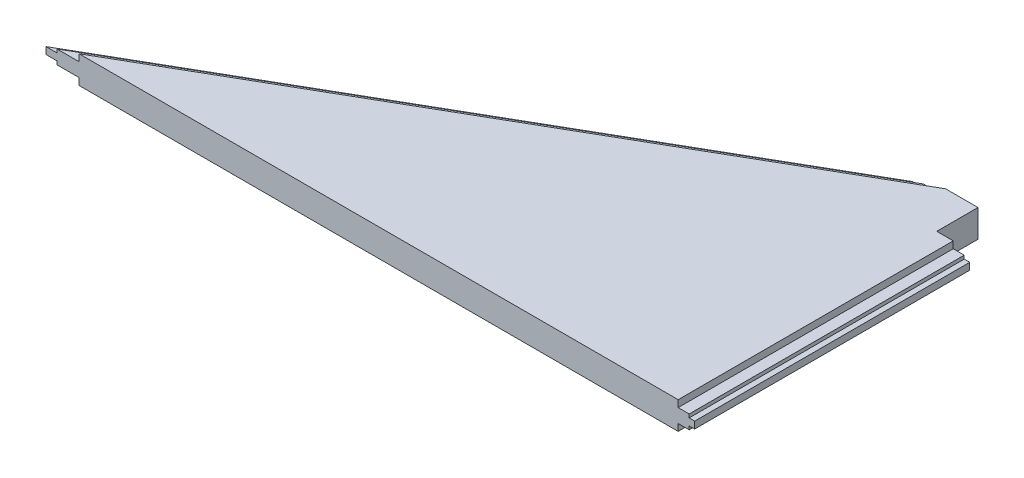
ISO-10303-21;
HEADER;
FILE_DESCRIPTION(('STEP AP214'),'2;1');
FILE_NAME('part.step','',(''),(''),'','','');
FILE_SCHEMA(('AUTOMOTIVE_DESIGN { 1 0 10303 214 1 1 1 1 }'));
ENDSEC;
DATA;
#1=APPLICATION_CONTEXT('core data for automotive mechanical design processes');
#2=APPLICATION_PROTOCOL_DEFINITION('international standard','automotive_design',2000,#1);
#3=PRODUCT_CONTEXT('',#1,'mechanical');
#4=PRODUCT('Part','Part','',(#3));
#5=PRODUCT_RELATED_PRODUCT_CATEGORY('part','',(#4));
#6=PRODUCT_DEFINITION_FORMATION('','',#4);
#7=PRODUCT_DEFINITION_CONTEXT('part definition',#1,'design');
#8=PRODUCT_DEFINITION('design','',#6,#7);
#9=PRODUCT_DEFINITION_SHAPE('','',#8);
#10=(LENGTH_UNIT() NAMED_UNIT(*) SI_UNIT(.MILLI.,.METRE.));
#11=(NAMED_UNIT(*) PLANE_ANGLE_UNIT() SI_UNIT($,.RADIAN.));
#12=(NAMED_UNIT(*) SI_UNIT($,.STERADIAN.) SOLID_ANGLE_UNIT());
#13=UNCERTAINTY_MEASURE_WITH_UNIT(LENGTH_MEASURE(1.E-05),#10,'distance_accuracy_value','');
#14=(GEOMETRIC_REPRESENTATION_CONTEXT(3) GLOBAL_UNCERTAINTY_ASSIGNED_CONTEXT((#13)) GLOBAL_UNIT_ASSIGNED_CONTEXT((#10,
#11,#12)) REPRESENTATION_CONTEXT('',''));
#15=CARTESIAN_POINT('',(0.,0.,0.));
#16=DIRECTION('',(0.,0.,1.));
#17=DIRECTION('',(1.,0.,0.));
#18=AXIS2_PLACEMENT_3D('',#15,#16,#17);
#19=CARTESIAN_POINT('',(0.,-6.35,-146.05));
#20=DIRECTION('',(0.,0.,-1.));
#21=DIRECTION('',(-1.,0.,0.));
#22=AXIS2_PLACEMENT_3D('',#19,#20,#21);
#23=PLANE('',#22);
#24=DIRECTION('',(0.,1.,0.));
#25=VECTOR('',#24,1.);
#26=CARTESIAN_POINT('',(-50.8,-15.24,-146.05));
#27=LINE('',#26,#25);
#28=CARTESIAN_POINT('',(-50.8,-6.35,-146.05));
#29=VERTEX_POINT('',#28);
#30=CARTESIAN_POINT('',(-50.8,6.35,-146.05));
#31=VERTEX_POINT('',#30);
#32=EDGE_CURVE('E197',#29,#31,#27,.T.);
#33=ORIENTED_EDGE('',*,*,#32,.F.);
#34=DIRECTION('',(-1.,0.,0.));
#35=VECTOR('',#34,1.);
#36=CARTESIAN_POINT('',(0.,-6.35,-146.05));
#37=LINE('',#36,#35);
#38=CARTESIAN_POINT('',(-65.7751226527547,-6.35,-146.05));
#39=VERTEX_POINT('',#38);
#40=EDGE_CURVE('E226',#29,#39,#37,.T.);
#41=ORIENTED_EDGE('',*,*,#40,.T.);
#42=DIRECTION('',(0.,-1.,0.));
#43=VECTOR('',#42,1.);
#44=CARTESIAN_POINT('',(-65.7751226527547,-6.35,-146.05));
#45=LINE('',#44,#43);
#46=CARTESIAN_POINT('',(-65.7751226527545,-3.175,-146.05));
#47=VERTEX_POINT('',#46);
#48=EDGE_CURVE('E342',#47,#39,#45,.T.);
#49=ORIENTED_EDGE('',*,*,#48,.F.);
#50=DIRECTION('',(1.,0.,0.));
#51=VECTOR('',#50,1.);
#52=CARTESIAN_POINT('',(0.,-3.175,-146.05));
#53=LINE('',#52,#51);
#54=CARTESIAN_POINT('',(-75.9662846936072,-3.175,-146.05));
#55=VERTEX_POINT('',#54);
#56=EDGE_CURVE('E376',#55,#47,#53,.T.);
#57=ORIENTED_EDGE('',*,*,#56,.F.);
#58=DIRECTION('',(0.,1.,0.));
#59=VECTOR('',#58,1.);
#60=CARTESIAN_POINT('',(-75.9662846936071,-6.35,-146.05));
#61=LINE('',#60,#59);
#62=CARTESIAN_POINT('',(-75.9662846936073,-1.5875,-146.05));
#63=VERTEX_POINT('',#62);
#64=EDGE_CURVE('E368',#55,#63,#61,.T.);
#65=ORIENTED_EDGE('',*,*,#64,.T.);
#66=DIRECTION('',(-1.,0.,0.));
#67=VECTOR('',#66,1.);
#68=CARTESIAN_POINT('',(0.,-1.58749999999999,-146.05));
#69=LINE('',#68,#67);
#70=CARTESIAN_POINT('',(-81.0618657140334,-1.5875,-146.05));
#71=VERTEX_POINT('',#70);
#72=EDGE_CURVE('E334',#63,#71,#69,.T.);
#73=ORIENTED_EDGE('',*,*,#72,.T.);
#74=DIRECTION('',(0.,1.,0.));
#75=VECTOR('',#74,1.);
#76=CARTESIAN_POINT('',(-81.0618657140334,-6.35,-146.05));
#77=LINE('',#76,#75);
#78=CARTESIAN_POINT('',(-81.0618657140334,1.5875,-146.05));
#79=VERTEX_POINT('',#78);
#80=EDGE_CURVE('E338',#71,#79,#77,.T.);
#81=ORIENTED_EDGE('',*,*,#80,.T.);
#82=DIRECTION('',(1.,0.,0.));
#83=VECTOR('',#82,1.);
#84=CARTESIAN_POINT('',(0.,1.58750000000001,-146.05));
#85=LINE('',#84,#83);
#86=CARTESIAN_POINT('',(-75.9662846936072,1.5875,-146.05));
#87=VERTEX_POINT('',#86);
#88=EDGE_CURVE('E320',#79,#87,#85,.T.);
#89=ORIENTED_EDGE('',*,*,#88,.T.);
#90=DIRECTION('',(0.,1.,0.));
#91=VECTOR('',#90,1.);
#92=CARTESIAN_POINT('',(-75.9662846936071,-6.35,-146.05));
#93=LINE('',#92,#91);
#94=CARTESIAN_POINT('',(-75.9662846936071,3.175,-146.05));
#95=VERTEX_POINT('',#94);
#96=EDGE_CURVE('E353',#87,#95,#93,.T.);
#97=ORIENTED_EDGE('',*,*,#96,.T.);
#98=DIRECTION('',(1.,0.,0.));
#99=VECTOR('',#98,1.);
#100=CARTESIAN_POINT('',(0.,3.175,-146.05));
#101=LINE('',#100,#99);
#102=CARTESIAN_POINT('',(-65.7751226527548,3.175,-146.05));
#103=VERTEX_POINT('',#102);
#104=EDGE_CURVE('E361',#95,#103,#101,.T.);
#105=ORIENTED_EDGE('',*,*,#104,.T.);
#106=DIRECTION('',(0.,1.,0.));
#107=VECTOR('',#106,1.);
#108=CARTESIAN_POINT('',(-65.7751226527547,-6.35,-146.05));
#109=LINE('',#108,#107);
#110=CARTESIAN_POINT('',(-65.7751226527547,6.35,-146.05));
#111=VERTEX_POINT('',#110);
#112=EDGE_CURVE('E219',#103,#111,#109,.T.);
#113=ORIENTED_EDGE('',*,*,#112,.T.);
#114=DIRECTION('',(-1.,0.,0.));
#115=VECTOR('',#114,1.);
#116=CARTESIAN_POINT('',(0.,6.35,-146.05));
#117=LINE('',#116,#115);
#118=EDGE_CURVE('E214',#31,#111,#117,.T.);
#119=ORIENTED_EDGE('',*,*,#118,.F.);
#120=EDGE_LOOP('',(#33,#41,#49,#57,#65,#73,#81,#89,#97,#105,#113,#119));
#121=FACE_BOUND('',#120,.T.);
#122=ADVANCED_FACE('F47',(#121),#23,.T.);
#123=CARTESIAN_POINT('',(-406.4,-6.35,0.));
#124=DIRECTION('',(0.,0.,1.));
#125=DIRECTION('',(1.,0.,0.));
#126=AXIS2_PLACEMENT_3D('',#123,#124,#125);
#127=PLANE('',#126);
#128=DIRECTION('',(1.,0.,0.));
#129=VECTOR('',#128,1.);
#130=CARTESIAN_POINT('',(-406.4,6.35,0.));
#131=LINE('',#130,#129);
#132=CARTESIAN_POINT('',(-319.775122652755,6.35,0.));
#133=VERTEX_POINT('',#132);
#134=CARTESIAN_POINT('',(-43.18,6.35,0.));
#135=VERTEX_POINT('',#134);
#136=EDGE_CURVE('E221',#133,#135,#131,.T.);
#137=ORIENTED_EDGE('',*,*,#136,.F.);
#138=DIRECTION('',(0.,-1.,0.));
#139=VECTOR('',#138,1.);
#140=CARTESIAN_POINT('',(-319.775122652755,-6.35,0.));
#141=LINE('',#140,#139);
#142=CARTESIAN_POINT('',(-319.775122652755,3.175,0.));
#143=VERTEX_POINT('',#142);
#144=EDGE_CURVE('E70',#133,#143,#141,.T.);
#145=ORIENTED_EDGE('',*,*,#144,.T.);
#146=DIRECTION('',(-1.,0.,0.));
#147=VECTOR('',#146,1.);
#148=CARTESIAN_POINT('',(-406.4,3.175,0.));
#149=LINE('',#148,#147);
#150=CARTESIAN_POINT('',(-329.966284693607,3.175,0.));
#151=VERTEX_POINT('',#150);
#152=EDGE_CURVE('E364',#143,#151,#149,.T.);
#153=ORIENTED_EDGE('',*,*,#152,.T.);
#154=DIRECTION('',(0.,-1.,0.));
#155=VECTOR('',#154,1.);
#156=CARTESIAN_POINT('',(-329.966284693607,-6.35,0.));
#157=LINE('',#156,#155);
#158=CARTESIAN_POINT('',(-329.966284693607,1.5875,0.));
#159=VERTEX_POINT('',#158);
#160=EDGE_CURVE('E357',#151,#159,#157,.T.);
#161=ORIENTED_EDGE('',*,*,#160,.T.);
#162=DIRECTION('',(-1.,0.,0.));
#163=VECTOR('',#162,1.);
#164=CARTESIAN_POINT('',(-406.4,1.58749999999999,0.));
#165=LINE('',#164,#163);
#166=CARTESIAN_POINT('',(-335.061865714034,1.5875,0.));
#167=VERTEX_POINT('',#166);
#168=EDGE_CURVE('E262',#159,#167,#165,.T.);
#169=ORIENTED_EDGE('',*,*,#168,.T.);
#170=DIRECTION('',(0.,-1.,0.));
#171=VECTOR('',#170,1.);
#172=CARTESIAN_POINT('',(-335.061865714034,-6.35,0.));
#173=LINE('',#172,#171);
#174=CARTESIAN_POINT('',(-335.061865714034,-1.5875,0.));
#175=VERTEX_POINT('',#174);
#176=EDGE_CURVE('E254',#167,#175,#173,.T.);
#177=ORIENTED_EDGE('',*,*,#176,.T.);
#178=DIRECTION('',(1.,0.,0.));
#179=VECTOR('',#178,1.);
#180=CARTESIAN_POINT('',(-406.4,-1.58750000000001,0.));
#181=LINE('',#180,#179);
#182=CARTESIAN_POINT('',(-329.966284693607,-1.5875,0.));
#183=VERTEX_POINT('',#182);
#184=EDGE_CURVE('E258',#175,#183,#181,.T.);
#185=ORIENTED_EDGE('',*,*,#184,.T.);
#186=DIRECTION('',(0.,-1.,0.));
#187=VECTOR('',#186,1.);
#188=CARTESIAN_POINT('',(-329.966284693607,-6.35,0.));
#189=LINE('',#188,#187);
#190=CARTESIAN_POINT('',(-329.966284693607,-3.175,0.));
#191=VERTEX_POINT('',#190);
#192=EDGE_CURVE('E372',#183,#191,#189,.T.);
#193=ORIENTED_EDGE('',*,*,#192,.T.);
#194=DIRECTION('',(-1.,0.,0.));
#195=VECTOR('',#194,1.);
#196=CARTESIAN_POINT('',(-406.4,-3.175,0.));
#197=LINE('',#196,#195);
#198=CARTESIAN_POINT('',(-319.775122652755,-3.175,0.));
#199=VERTEX_POINT('',#198);
#200=EDGE_CURVE('E379',#199,#191,#197,.T.);
#201=ORIENTED_EDGE('',*,*,#200,.F.);
#202=DIRECTION('',(0.,1.,0.));
#203=VECTOR('',#202,1.);
#204=CARTESIAN_POINT('',(-319.775122652755,-6.35,0.));
#205=LINE('',#204,#203);
#206=CARTESIAN_POINT('',(-319.775122652755,-6.35,0.));
#207=VERTEX_POINT('',#206);
#208=EDGE_CURVE('E346',#207,#199,#205,.T.);
#209=ORIENTED_EDGE('',*,*,#208,.F.);
#210=DIRECTION('',(1.,0.,0.));
#211=VECTOR('',#210,1.);
#212=CARTESIAN_POINT('',(-406.4,-6.35,0.));
#213=LINE('',#212,#211);
#214=CARTESIAN_POINT('',(-43.18,-6.35,0.));
#215=VERTEX_POINT('',#214);
#216=EDGE_CURVE('E235',#207,#215,#213,.T.);
#217=ORIENTED_EDGE('',*,*,#216,.T.);
#218=DIRECTION('',(0.,1.,0.));
#219=VECTOR('',#218,1.);
#220=CARTESIAN_POINT('',(-43.1799999999999,-6.35,0.));
#221=LINE('',#220,#219);
#222=CARTESIAN_POINT('',(-43.18,-3.175,0.));
#223=VERTEX_POINT('',#222);
#224=EDGE_CURVE('E292',#215,#223,#221,.T.);
#225=ORIENTED_EDGE('',*,*,#224,.T.);
#226=DIRECTION('',(1.,0.,0.));
#227=VECTOR('',#226,1.);
#228=CARTESIAN_POINT('',(-38.1,-3.175,0.));
#229=LINE('',#228,#227);
#230=CARTESIAN_POINT('',(-38.1,-3.175,0.));
#231=VERTEX_POINT('',#230);
#232=EDGE_CURVE('E229',#223,#231,#229,.T.);
#233=ORIENTED_EDGE('',*,*,#232,.T.);
#234=DIRECTION('',(0.,-1.,0.));
#235=VECTOR('',#234,1.);
#236=CARTESIAN_POINT('',(-38.1,-6.35000000000322,0.));
#237=LINE('',#236,#235);
#238=CARTESIAN_POINT('',(-38.0999999999999,-1.5875,0.));
#239=VERTEX_POINT('',#238);
#240=EDGE_CURVE('E312',#239,#231,#237,.T.);
#241=ORIENTED_EDGE('',*,*,#240,.F.);
#242=DIRECTION('',(-1.,0.,0.));
#243=VECTOR('',#242,1.);
#244=CARTESIAN_POINT('',(-406.4,-1.58749999999997,0.));
#245=LINE('',#244,#243);
#246=CARTESIAN_POINT('',(-35.5599999999999,-1.5875,0.));
#247=VERTEX_POINT('',#246);
#248=EDGE_CURVE('E251',#247,#239,#245,.T.);
#249=ORIENTED_EDGE('',*,*,#248,.F.);
#250=DIRECTION('',(0.,-1.,0.));
#251=VECTOR('',#250,1.);
#252=CARTESIAN_POINT('',(-35.5599999999999,-6.35,0.));
#253=LINE('',#252,#251);
#254=CARTESIAN_POINT('',(-35.5599999999999,1.5875,0.));
#255=VERTEX_POINT('',#254);
#256=EDGE_CURVE('E248',#255,#247,#253,.T.);
#257=ORIENTED_EDGE('',*,*,#256,.F.);
#258=DIRECTION('',(1.,0.,0.));
#259=VECTOR('',#258,1.);
#260=CARTESIAN_POINT('',(-406.4,1.5875,0.));
#261=LINE('',#260,#259);
#262=CARTESIAN_POINT('',(-38.0999999999999,1.5875,0.));
#263=VERTEX_POINT('',#262);
#264=EDGE_CURVE('E245',#263,#255,#261,.T.);
#265=ORIENTED_EDGE('',*,*,#264,.F.);
#266=DIRECTION('',(0.,-1.,0.));
#267=VECTOR('',#266,1.);
#268=CARTESIAN_POINT('',(-38.0999999999999,-6.34999999999678,0.));
#269=LINE('',#268,#267);
#270=CARTESIAN_POINT('',(-38.1,3.175,0.));
#271=VERTEX_POINT('',#270);
#272=EDGE_CURVE('E285',#271,#263,#269,.T.);
#273=ORIENTED_EDGE('',*,*,#272,.F.);
#274=DIRECTION('',(1.,0.,0.));
#275=VECTOR('',#274,1.);
#276=CARTESIAN_POINT('',(-38.1,3.175,0.));
#277=LINE('',#276,#275);
#278=CARTESIAN_POINT('',(-43.18,3.175,0.));
#279=VERTEX_POINT('',#278);
#280=EDGE_CURVE('E222',#279,#271,#277,.T.);
#281=ORIENTED_EDGE('',*,*,#280,.F.);
#282=DIRECTION('',(0.,-1.,0.));
#283=VECTOR('',#282,1.);
#284=CARTESIAN_POINT('',(-43.1799999999999,-6.35,0.));
#285=LINE('',#284,#283);
#286=EDGE_CURVE('E283',#135,#279,#285,.T.);
#287=ORIENTED_EDGE('',*,*,#286,.F.);
#288=EDGE_LOOP('',(#137,#145,#153,#161,#169,#177,#185,#193,#201,#209,#217,#225,#233,#241,#249,
#257,#265,#273,#281,#287));
#289=FACE_BOUND('',#288,.T.);
#290=ADVANCED_FACE('F282',(#289),#127,.T.);
#291=CARTESIAN_POINT('',(0.,6.35,0.));
#292=DIRECTION('',(0.,-1.,0.));
#293=DIRECTION('',(0.,0.,-1.));
#294=AXIS2_PLACEMENT_3D('',#291,#292,#293);
#295=PLANE('',#294);
#296=DIRECTION('',(0.,0.,-1.));
#297=VECTOR('',#296,1.);
#298=CARTESIAN_POINT('',(-43.1799999999999,6.35,11.0490000000001));
#299=LINE('',#298,#297);
#300=CARTESIAN_POINT('',(-43.18,6.35,-127.));
#301=VERTEX_POINT('',#300);
#302=EDGE_CURVE('E290',#135,#301,#299,.T.);
#303=ORIENTED_EDGE('',*,*,#302,.T.);
#304=DIRECTION('',(1.,0.,0.));
#305=VECTOR('',#304,1.);
#306=CARTESIAN_POINT('',(-50.8,6.35,-127.));
#307=LINE('',#306,#305);
#308=CARTESIAN_POINT('',(-50.8,6.35,-127.));
#309=VERTEX_POINT('',#308);
#310=EDGE_CURVE('E209',#309,#301,#307,.T.);
#311=ORIENTED_EDGE('',*,*,#310,.F.);
#312=DIRECTION('',(0.,0.,1.));
#313=VECTOR('',#312,1.);
#314=CARTESIAN_POINT('',(-50.8,6.35,-146.05));
#315=LINE('',#314,#313);
#316=EDGE_CURVE('E201',#31,#309,#315,.T.);
#317=ORIENTED_EDGE('',*,*,#316,.F.);
#318=ORIENTED_EDGE('',*,*,#118,.T.);
#319=DIRECTION('',(0.866906303057535,0.,-0.498471124258082));
#320=VECTOR('',#319,1.);
#321=CARTESIAN_POINT('',(-424.945372258804,6.35,60.4728935234783));
#322=LINE('',#321,#320);
#323=EDGE_CURVE('E394',#133,#111,#322,.T.);
#324=ORIENTED_EDGE('',*,*,#323,.F.);
#325=ORIENTED_EDGE('',*,*,#136,.T.);
#326=EDGE_LOOP('',(#303,#311,#317,#318,#324,#325));
#327=FACE_BOUND('',#326,.T.);
#328=ADVANCED_FACE('F213',(#327),#295,.F.);
#329=CARTESIAN_POINT('',(0.,-6.35,0.));
#330=DIRECTION('',(0.,-1.,0.));
#331=DIRECTION('',(0.,0.,-1.));
#332=AXIS2_PLACEMENT_3D('',#329,#330,#331);
#333=PLANE('',#332);
#334=DIRECTION('',(-1.,0.,0.));
#335=VECTOR('',#334,1.);
#336=CARTESIAN_POINT('',(0.,-6.35,-127.));
#337=LINE('',#336,#335);
#338=CARTESIAN_POINT('',(-43.18,-6.35,-127.));
#339=VERTEX_POINT('',#338);
#340=CARTESIAN_POINT('',(-50.8,-6.35,-127.));
#341=VERTEX_POINT('',#340);
#342=EDGE_CURVE('E421',#339,#341,#337,.T.);
#343=ORIENTED_EDGE('',*,*,#342,.F.);
#344=DIRECTION('',(0.,0.,-1.));
#345=VECTOR('',#344,1.);
#346=CARTESIAN_POINT('',(-43.1799999999999,-6.35,11.0490000000001));
#347=LINE('',#346,#345);
#348=EDGE_CURVE('E304',#215,#339,#347,.T.);
#349=ORIENTED_EDGE('',*,*,#348,.F.);
#350=ORIENTED_EDGE('',*,*,#216,.F.);
#351=DIRECTION('',(0.866906303057535,0.,-0.498471124258082));
#352=VECTOR('',#351,1.);
#353=CARTESIAN_POINT('',(-424.945372258804,-6.35,60.4728935234783));
#354=LINE('',#353,#352);
#355=EDGE_CURVE('E397',#207,#39,#354,.T.);
#356=ORIENTED_EDGE('',*,*,#355,.T.);
#357=ORIENTED_EDGE('',*,*,#40,.F.);
#358=DIRECTION('',(0.,0.,-1.));
#359=VECTOR('',#358,1.);
#360=CARTESIAN_POINT('',(-50.8,-6.35,0.));
#361=LINE('',#360,#359);
#362=EDGE_CURVE('E11',#341,#29,#361,.T.);
#363=ORIENTED_EDGE('',*,*,#362,.F.);
#364=EDGE_LOOP('',(#343,#349,#350,#356,#357,#363));
#365=FACE_BOUND('',#364,.T.);
#366=ADVANCED_FACE('F480',(#365),#333,.T.);
#367=CARTESIAN_POINT('',(-38.1,3.175,0.));
#368=DIRECTION('',(0.,-1.,0.));
#369=DIRECTION('',(0.,0.,-1.));
#370=AXIS2_PLACEMENT_3D('',#367,#368,#369);
#371=PLANE('',#370);
#372=DIRECTION('',(0.,0.,-1.));
#373=VECTOR('',#372,1.);
#374=CARTESIAN_POINT('',(-38.1,3.175,0.));
#375=LINE('',#374,#373);
#376=CARTESIAN_POINT('',(-38.1,3.175,-127.));
#377=VERTEX_POINT('',#376);
#378=EDGE_CURVE('E241',#271,#377,#375,.T.);
#379=ORIENTED_EDGE('',*,*,#378,.T.);
#380=DIRECTION('',(-1.,0.,0.));
#381=VECTOR('',#380,1.);
#382=CARTESIAN_POINT('',(-38.1,3.175,-127.));
#383=LINE('',#382,#381);
#384=CARTESIAN_POINT('',(-43.18,3.175,-127.));
#385=VERTEX_POINT('',#384);
#386=EDGE_CURVE('E62',#377,#385,#383,.T.);
#387=ORIENTED_EDGE('',*,*,#386,.T.);
#388=DIRECTION('',(0.,0.,-1.));
#389=VECTOR('',#388,1.);
#390=CARTESIAN_POINT('',(-43.1799999999999,3.175,11.0490000000001));
#391=LINE('',#390,#389);
#392=EDGE_CURVE('E277',#279,#385,#391,.T.);
#393=ORIENTED_EDGE('',*,*,#392,.F.);
#394=ORIENTED_EDGE('',*,*,#280,.T.);
#395=EDGE_LOOP('',(#379,#387,#393,#394));
#396=FACE_BOUND('',#395,.T.);
#397=ADVANCED_FACE('F274',(#396),#371,.F.);
#398=CARTESIAN_POINT('',(-38.1,-3.175,0.));
#399=DIRECTION('',(0.,1.,0.));
#400=DIRECTION('',(0.,0.,1.));
#401=AXIS2_PLACEMENT_3D('',#398,#399,#400);
#402=PLANE('',#401);
#403=DIRECTION('',(0.,0.,-1.));
#404=VECTOR('',#403,1.);
#405=CARTESIAN_POINT('',(-43.1799999999999,-3.175,11.0490000000001));
#406=LINE('',#405,#404);
#407=CARTESIAN_POINT('',(-43.18,-3.175,-127.));
#408=VERTEX_POINT('',#407);
#409=EDGE_CURVE('E300',#223,#408,#406,.T.);
#410=ORIENTED_EDGE('',*,*,#409,.T.);
#411=DIRECTION('',(1.,0.,0.));
#412=VECTOR('',#411,1.);
#413=CARTESIAN_POINT('',(-38.1,-3.175,-127.));
#414=LINE('',#413,#412);
#415=CARTESIAN_POINT('',(-38.1,-3.175,-127.));
#416=VERTEX_POINT('',#415);
#417=EDGE_CURVE('E427',#408,#416,#414,.T.);
#418=ORIENTED_EDGE('',*,*,#417,.T.);
#419=DIRECTION('',(0.,0.,1.));
#420=VECTOR('',#419,1.);
#421=CARTESIAN_POINT('',(-38.1,-3.175,0.));
#422=LINE('',#421,#420);
#423=EDGE_CURVE('E238',#416,#231,#422,.T.);
#424=ORIENTED_EDGE('',*,*,#423,.T.);
#425=ORIENTED_EDGE('',*,*,#232,.F.);
#426=EDGE_LOOP('',(#410,#418,#424,#425));
#427=FACE_BOUND('',#426,.T.);
#428=ADVANCED_FACE('F486',(#427),#402,.F.);
#429=CARTESIAN_POINT('',(-43.1799999999999,0.,11.0490000000001));
#430=DIRECTION('',(1.,0.,0.));
#431=DIRECTION('',(0.,0.,-1.));
#432=AXIS2_PLACEMENT_3D('',#429,#430,#431);
#433=PLANE('',#432);
#434=DIRECTION('',(0.,-1.,0.));
#435=VECTOR('',#434,1.);
#436=CARTESIAN_POINT('',(-43.18,0.,-127.));
#437=LINE('',#436,#435);
#438=EDGE_CURVE('E424',#408,#339,#437,.T.);
#439=ORIENTED_EDGE('',*,*,#438,.F.);
#440=ORIENTED_EDGE('',*,*,#409,.F.);
#441=ORIENTED_EDGE('',*,*,#224,.F.);
#442=ORIENTED_EDGE('',*,*,#348,.T.);
#443=EDGE_LOOP('',(#439,#440,#441,#442));
#444=FACE_BOUND('',#443,.T.);
#445=ADVANCED_FACE('F489',(#444),#433,.T.);
#446=CARTESIAN_POINT('',(-43.1799999999999,0.,11.0490000000001));
#447=DIRECTION('',(-1.,0.,0.));
#448=DIRECTION('',(0.,0.,1.));
#449=AXIS2_PLACEMENT_3D('',#446,#447,#448);
#450=PLANE('',#449);
#451=ORIENTED_EDGE('',*,*,#392,.T.);
#452=DIRECTION('',(0.,1.,0.));
#453=VECTOR('',#452,1.);
#454=CARTESIAN_POINT('',(-43.18,0.,-127.));
#455=LINE('',#454,#453);
#456=EDGE_CURVE('E439',#385,#301,#455,.T.);
#457=ORIENTED_EDGE('',*,*,#456,.T.);
#458=ORIENTED_EDGE('',*,*,#302,.F.);
#459=ORIENTED_EDGE('',*,*,#286,.T.);
#460=EDGE_LOOP('',(#451,#457,#458,#459));
#461=FACE_BOUND('',#460,.T.);
#462=ADVANCED_FACE('F288',(#461),#450,.F.);
#463=CARTESIAN_POINT('',(0.,1.5875,11.0490000000001));
#464=DIRECTION('',(0.,-1.,0.));
#465=DIRECTION('',(0.,0.,-1.));
#466=AXIS2_PLACEMENT_3D('',#463,#464,#465);
#467=PLANE('',#466);
#468=DIRECTION('',(0.,0.,-1.));
#469=VECTOR('',#468,1.);
#470=CARTESIAN_POINT('',(-35.5599999999999,1.5875,11.0490000000001));
#471=LINE('',#470,#469);
#472=CARTESIAN_POINT('',(-35.5599999999999,1.5875,-127.));
#473=VERTEX_POINT('',#472);
#474=EDGE_CURVE('E316',#255,#473,#471,.T.);
#475=ORIENTED_EDGE('',*,*,#474,.T.);
#476=DIRECTION('',(-1.,0.,0.));
#477=VECTOR('',#476,1.);
#478=CARTESIAN_POINT('',(0.,1.5875,-127.));
#479=LINE('',#478,#477);
#480=CARTESIAN_POINT('',(-38.1,1.5875,-127.));
#481=VERTEX_POINT('',#480);
#482=EDGE_CURVE('E448',#473,#481,#479,.T.);
#483=ORIENTED_EDGE('',*,*,#482,.T.);
#484=DIRECTION('',(0.,0.,-1.));
#485=VECTOR('',#484,1.);
#486=CARTESIAN_POINT('',(-38.0999999999999,1.5875,11.0490000000001));
#487=LINE('',#486,#485);
#488=EDGE_CURVE('E271',#263,#481,#487,.T.);
#489=ORIENTED_EDGE('',*,*,#488,.F.);
#490=ORIENTED_EDGE('',*,*,#264,.T.);
#491=EDGE_LOOP('',(#475,#483,#489,#490));
#492=FACE_BOUND('',#491,.T.);
#493=ADVANCED_FACE('F498',(#492),#467,.F.);
#494=CARTESIAN_POINT('',(-35.5599999999999,0.,11.0490000000001));
#495=DIRECTION('',(-1.,0.,0.));
#496=DIRECTION('',(0.,0.,1.));
#497=AXIS2_PLACEMENT_3D('',#494,#495,#496);
#498=PLANE('',#497);
#499=DIRECTION('',(0.,0.,-1.));
#500=VECTOR('',#499,1.);
#501=CARTESIAN_POINT('',(-35.5599999999999,-1.5875,11.0490000000001));
#502=LINE('',#501,#500);
#503=CARTESIAN_POINT('',(-35.56,-1.5875,-127.));
#504=VERTEX_POINT('',#503);
#505=EDGE_CURVE('E324',#247,#504,#502,.T.);
#506=ORIENTED_EDGE('',*,*,#505,.T.);
#507=DIRECTION('',(0.,1.,0.));
#508=VECTOR('',#507,1.);
#509=CARTESIAN_POINT('',(-35.56,0.,-127.));
#510=LINE('',#509,#508);
#511=EDGE_CURVE('E442',#504,#473,#510,.T.);
#512=ORIENTED_EDGE('',*,*,#511,.T.);
#513=ORIENTED_EDGE('',*,*,#474,.F.);
#514=ORIENTED_EDGE('',*,*,#256,.T.);
#515=EDGE_LOOP('',(#506,#512,#513,#514));
#516=FACE_BOUND('',#515,.T.);
#517=ADVANCED_FACE('F501',(#516),#498,.F.);
#518=CARTESIAN_POINT('',(0.,-1.5875,11.0490000000001));
#519=DIRECTION('',(0.,1.,0.));
#520=DIRECTION('',(-1.,0.,0.));
#521=AXIS2_PLACEMENT_3D('',#518,#519,#520);
#522=PLANE('',#521);
#523=DIRECTION('',(0.,0.,-1.));
#524=VECTOR('',#523,1.);
#525=CARTESIAN_POINT('',(-38.0999999999999,-1.5875,11.0490000000001));
#526=LINE('',#525,#524);
#527=CARTESIAN_POINT('',(-38.1,-1.5875,-127.));
#528=VERTEX_POINT('',#527);
#529=EDGE_CURVE('E319',#239,#528,#526,.T.);
#530=ORIENTED_EDGE('',*,*,#529,.T.);
#531=DIRECTION('',(1.,0.,0.));
#532=VECTOR('',#531,1.);
#533=CARTESIAN_POINT('',(0.,-1.5875,-127.));
#534=LINE('',#533,#532);
#535=EDGE_CURVE('E435',#528,#504,#534,.T.);
#536=ORIENTED_EDGE('',*,*,#535,.T.);
#537=ORIENTED_EDGE('',*,*,#505,.F.);
#538=ORIENTED_EDGE('',*,*,#248,.T.);
#539=EDGE_LOOP('',(#530,#536,#537,#538));
#540=FACE_BOUND('',#539,.T.);
#541=ADVANCED_FACE('F509',(#540),#522,.F.);
#542=CARTESIAN_POINT('',(-38.0999999999999,3.33066907387546E-13,11.0490000000001));
#543=DIRECTION('',(-1.,0.,0.));
#544=DIRECTION('',(0.,-1.,0.));
#545=AXIS2_PLACEMENT_3D('',#542,#543,#544);
#546=PLANE('',#545);
#547=ORIENTED_EDGE('',*,*,#423,.F.);
#548=DIRECTION('',(0.,1.,0.));
#549=VECTOR('',#548,1.);
#550=CARTESIAN_POINT('',(-38.1,3.33066907387547E-13,-127.));
#551=LINE('',#550,#549);
#552=EDGE_CURVE('E431',#416,#528,#551,.T.);
#553=ORIENTED_EDGE('',*,*,#552,.T.);
#554=ORIENTED_EDGE('',*,*,#529,.F.);
#555=ORIENTED_EDGE('',*,*,#240,.T.);
#556=EDGE_LOOP('',(#547,#553,#554,#555));
#557=FACE_BOUND('',#556,.T.);
#558=ADVANCED_FACE('F506',(#557),#546,.F.);
#559=CARTESIAN_POINT('',(-38.0999999999999,-3.33066907387546E-13,11.0490000000001));
#560=DIRECTION('',(-1.,0.,0.));
#561=DIRECTION('',(0.,-1.,0.));
#562=AXIS2_PLACEMENT_3D('',#559,#560,#561);
#563=PLANE('',#562);
#564=ORIENTED_EDGE('',*,*,#488,.T.);
#565=DIRECTION('',(0.,1.,0.));
#566=VECTOR('',#565,1.);
#567=CARTESIAN_POINT('',(-38.1,-3.33066907387547E-13,-127.));
#568=LINE('',#567,#566);
#569=EDGE_CURVE('E55',#481,#377,#568,.T.);
#570=ORIENTED_EDGE('',*,*,#569,.T.);
#571=ORIENTED_EDGE('',*,*,#378,.F.);
#572=ORIENTED_EDGE('',*,*,#272,.T.);
#573=EDGE_LOOP('',(#564,#570,#571,#572));
#574=FACE_BOUND('',#573,.T.);
#575=ADVANCED_FACE('F268',(#574),#563,.F.);
#576=CARTESIAN_POINT('',(-345.489740561619,1.58750000000003,198.656600822931));
#577=DIRECTION('',(0.,1.,0.));
#578=DIRECTION('',(0.,0.,1.));
#579=AXIS2_PLACEMENT_3D('',#576,#577,#578);
#580=PLANE('',#579);
#581=DIRECTION('',(0.866906303057535,0.,-0.498471124258082));
#582=VECTOR('',#581,1.);
#583=CARTESIAN_POINT('',(-428.743722225651,1.5875,53.8670674941799));
#584=LINE('',#583,#582);
#585=EDGE_CURVE('E417',#167,#79,#584,.T.);
#586=ORIENTED_EDGE('',*,*,#585,.F.);
#587=ORIENTED_EDGE('',*,*,#168,.F.);
#588=DIRECTION('',(0.866906303057535,0.,-0.498471124258082));
#589=VECTOR('',#588,1.);
#590=CARTESIAN_POINT('',(-427.477605570035,1.5875,56.069009503946));
#591=LINE('',#590,#589);
#592=EDGE_CURVE('E382',#159,#87,#591,.T.);
#593=ORIENTED_EDGE('',*,*,#592,.T.);
#594=ORIENTED_EDGE('',*,*,#88,.F.);
#595=EDGE_LOOP('',(#586,#587,#593,#594));
#596=FACE_BOUND('',#595,.T.);
#597=ADVANCED_FACE('F505',(#596),#580,.T.);
#598=CARTESIAN_POINT('',(-427.477605570035,0.,56.069009503946));
#599=DIRECTION('',(-0.498471124258082,0.,-0.866906303057535));
#600=DIRECTION('',(-0.866906303057535,0.,0.498471124258082));
#601=AXIS2_PLACEMENT_3D('',#598,#599,#600);
#602=PLANE('',#601);
#603=ORIENTED_EDGE('',*,*,#592,.F.);
#604=ORIENTED_EDGE('',*,*,#160,.F.);
#605=DIRECTION('',(0.866906303057535,0.,-0.498471124258082));
#606=VECTOR('',#605,1.);
#607=CARTESIAN_POINT('',(-427.477605570035,3.175,56.069009503946));
#608=LINE('',#607,#606);
#609=EDGE_CURVE('E386',#151,#95,#608,.T.);
#610=ORIENTED_EDGE('',*,*,#609,.T.);
#611=ORIENTED_EDGE('',*,*,#96,.F.);
#612=EDGE_LOOP('',(#603,#604,#610,#611));
#613=FACE_BOUND('',#612,.T.);
#614=ADVANCED_FACE('F469',(#613),#602,.T.);
#615=CARTESIAN_POINT('',(-345.489740561619,3.175,198.656600822931));
#616=DIRECTION('',(0.,1.,0.));
#617=DIRECTION('',(0.,0.,1.));
#618=AXIS2_PLACEMENT_3D('',#615,#616,#617);
#619=PLANE('',#618);
#620=ORIENTED_EDGE('',*,*,#609,.F.);
#621=ORIENTED_EDGE('',*,*,#152,.F.);
#622=DIRECTION('',(0.866906303057535,0.,-0.498471124258082));
#623=VECTOR('',#622,1.);
#624=CARTESIAN_POINT('',(-424.945372258804,3.175,60.4728935234783));
#625=LINE('',#624,#623);
#626=EDGE_CURVE('E390',#143,#103,#625,.T.);
#627=ORIENTED_EDGE('',*,*,#626,.T.);
#628=ORIENTED_EDGE('',*,*,#104,.F.);
#629=EDGE_LOOP('',(#620,#621,#627,#628));
#630=FACE_BOUND('',#629,.T.);
#631=ADVANCED_FACE('F457',(#630),#619,.T.);
#632=CARTESIAN_POINT('',(-424.945372258804,0.,60.4728935234783));
#633=DIRECTION('',(-0.498471124258082,0.,-0.866906303057535));
#634=DIRECTION('',(-0.866906303057535,0.,0.498471124258082));
#635=AXIS2_PLACEMENT_3D('',#632,#633,#634);
#636=PLANE('',#635);
#637=ORIENTED_EDGE('',*,*,#626,.F.);
#638=ORIENTED_EDGE('',*,*,#144,.F.);
#639=ORIENTED_EDGE('',*,*,#323,.T.);
#640=ORIENTED_EDGE('',*,*,#112,.F.);
#641=EDGE_LOOP('',(#637,#638,#639,#640));
#642=FACE_BOUND('',#641,.T.);
#643=ADVANCED_FACE('F458',(#642),#636,.T.);
#644=CARTESIAN_POINT('',(-424.945372258804,0.,60.4728935234783));
#645=DIRECTION('',(0.498471124258082,0.,0.866906303057535));
#646=DIRECTION('',(0.866906303057535,0.,-0.498471124258082));
#647=AXIS2_PLACEMENT_3D('',#644,#645,#646);
#648=PLANE('',#647);
#649=ORIENTED_EDGE('',*,*,#48,.T.);
#650=ORIENTED_EDGE('',*,*,#355,.F.);
#651=ORIENTED_EDGE('',*,*,#208,.T.);
#652=DIRECTION('',(0.866906303057535,0.,-0.498471124258082));
#653=VECTOR('',#652,1.);
#654=CARTESIAN_POINT('',(-424.945372258804,-3.175,60.4728935234783));
#655=LINE('',#654,#653);
#656=EDGE_CURVE('E401',#199,#47,#655,.T.);
#657=ORIENTED_EDGE('',*,*,#656,.T.);
#658=EDGE_LOOP('',(#649,#650,#651,#657));
#659=FACE_BOUND('',#658,.T.);
#660=ADVANCED_FACE('F460',(#659),#648,.F.);
#661=CARTESIAN_POINT('',(-345.489740561619,-3.17500000000001,198.656600822931));
#662=DIRECTION('',(0.,1.,0.));
#663=DIRECTION('',(0.,0.,1.));
#664=AXIS2_PLACEMENT_3D('',#661,#662,#663);
#665=PLANE('',#664);
#666=ORIENTED_EDGE('',*,*,#56,.T.);
#667=ORIENTED_EDGE('',*,*,#656,.F.);
#668=ORIENTED_EDGE('',*,*,#200,.T.);
#669=DIRECTION('',(0.866906303057535,0.,-0.498471124258082));
#670=VECTOR('',#669,1.);
#671=CARTESIAN_POINT('',(-427.477605570035,-3.175,56.069009503946));
#672=LINE('',#671,#670);
#673=EDGE_CURVE('E405',#191,#55,#672,.T.);
#674=ORIENTED_EDGE('',*,*,#673,.T.);
#675=EDGE_LOOP('',(#666,#667,#668,#674));
#676=FACE_BOUND('',#675,.T.);
#677=ADVANCED_FACE('F466',(#676),#665,.F.);
#678=CARTESIAN_POINT('',(-427.477605570035,0.,56.069009503946));
#679=DIRECTION('',(-0.498471124258082,0.,-0.866906303057535));
#680=DIRECTION('',(-0.866906303057535,0.,0.498471124258082));
#681=AXIS2_PLACEMENT_3D('',#678,#679,#680);
#682=PLANE('',#681);
#683=ORIENTED_EDGE('',*,*,#673,.F.);
#684=ORIENTED_EDGE('',*,*,#192,.F.);
#685=DIRECTION('',(0.866906303057535,0.,-0.498471124258082));
#686=VECTOR('',#685,1.);
#687=CARTESIAN_POINT('',(-427.477605570035,-1.5875,56.069009503946));
#688=LINE('',#687,#686);
#689=EDGE_CURVE('E409',#183,#63,#688,.T.);
#690=ORIENTED_EDGE('',*,*,#689,.T.);
#691=ORIENTED_EDGE('',*,*,#64,.F.);
#692=EDGE_LOOP('',(#683,#684,#690,#691));
#693=FACE_BOUND('',#692,.T.);
#694=ADVANCED_FACE('F535',(#693),#682,.T.);
#695=CARTESIAN_POINT('',(-345.489740561619,-1.58749999999997,198.656600822931));
#696=DIRECTION('',(0.,-1.,0.));
#697=DIRECTION('',(0.,0.,-1.));
#698=AXIS2_PLACEMENT_3D('',#695,#696,#697);
#699=PLANE('',#698);
#700=ORIENTED_EDGE('',*,*,#689,.F.);
#701=ORIENTED_EDGE('',*,*,#184,.F.);
#702=DIRECTION('',(0.866906303057535,0.,-0.498471124258082));
#703=VECTOR('',#702,1.);
#704=CARTESIAN_POINT('',(-428.743722225651,-1.5875,53.8670674941799));
#705=LINE('',#704,#703);
#706=EDGE_CURVE('E413',#175,#71,#705,.T.);
#707=ORIENTED_EDGE('',*,*,#706,.T.);
#708=ORIENTED_EDGE('',*,*,#72,.F.);
#709=EDGE_LOOP('',(#700,#701,#707,#708));
#710=FACE_BOUND('',#709,.T.);
#711=ADVANCED_FACE('F530',(#710),#699,.T.);
#712=CARTESIAN_POINT('',(-428.743722225651,0.,53.8670674941799));
#713=DIRECTION('',(-0.498471124258082,0.,-0.866906303057535));
#714=DIRECTION('',(-0.866906303057535,0.,0.498471124258082));
#715=AXIS2_PLACEMENT_3D('',#712,#713,#714);
#716=PLANE('',#715);
#717=ORIENTED_EDGE('',*,*,#706,.F.);
#718=ORIENTED_EDGE('',*,*,#176,.F.);
#719=ORIENTED_EDGE('',*,*,#585,.T.);
#720=ORIENTED_EDGE('',*,*,#80,.F.);
#721=EDGE_LOOP('',(#717,#718,#719,#720));
#722=FACE_BOUND('',#721,.T.);
#723=ADVANCED_FACE('F527',(#722),#716,.T.);
#724=CARTESIAN_POINT('',(-50.8,-15.24,-127.));
#725=DIRECTION('',(0.,0.,1.));
#726=DIRECTION('',(1.,0.,0.));
#727=AXIS2_PLACEMENT_3D('',#724,#725,#726);
#728=PLANE('',#727);
#729=ORIENTED_EDGE('',*,*,#342,.T.);
#730=DIRECTION('',(0.,1.,0.));
#731=VECTOR('',#730,1.);
#732=CARTESIAN_POINT('',(-50.8,-15.24,-127.));
#733=LINE('',#732,#731);
#734=EDGE_CURVE('E208',#341,#309,#733,.T.);
#735=ORIENTED_EDGE('',*,*,#734,.T.);
#736=ORIENTED_EDGE('',*,*,#310,.T.);
#737=ORIENTED_EDGE('',*,*,#456,.F.);
#738=ORIENTED_EDGE('',*,*,#386,.F.);
#739=ORIENTED_EDGE('',*,*,#569,.F.);
#740=ORIENTED_EDGE('',*,*,#482,.F.);
#741=ORIENTED_EDGE('',*,*,#511,.F.);
#742=ORIENTED_EDGE('',*,*,#535,.F.);
#743=ORIENTED_EDGE('',*,*,#552,.F.);
#744=ORIENTED_EDGE('',*,*,#417,.F.);
#745=ORIENTED_EDGE('',*,*,#438,.T.);
#746=EDGE_LOOP('',(#729,#735,#736,#737,#738,#739,#740,#741,#742,#743,#744,#745));
#747=FACE_BOUND('',#746,.T.);
#748=ADVANCED_FACE('F454',(#747),#728,.F.);
#749=CARTESIAN_POINT('',(-50.8,-15.24,-146.05));
#750=DIRECTION('',(-1.,0.,0.));
#751=DIRECTION('',(0.,0.,1.));
#752=AXIS2_PLACEMENT_3D('',#749,#750,#751);
#753=PLANE('',#752);
#754=ORIENTED_EDGE('',*,*,#362,.T.);
#755=ORIENTED_EDGE('',*,*,#32,.T.);
#756=ORIENTED_EDGE('',*,*,#316,.T.);
#757=ORIENTED_EDGE('',*,*,#734,.F.);
#758=EDGE_LOOP('',(#754,#755,#756,#757));
#759=FACE_BOUND('',#758,.T.);
#760=ADVANCED_FACE('F199',(#759),#753,.F.);
#761=CLOSED_SHELL('',(#122,#290,#328,#366,#397,#428,#445,#462,#493,#517,#541,#558,#575,#597,
#614,#631,#643,#660,#677,#694,#711,#723,#748,#760));
#762=MANIFOLD_SOLID_BREP('B2',#761);
#763=ADVANCED_BREP_SHAPE_REPRESENTATION('',(#18,#762),#14);
#764=SHAPE_DEFINITION_REPRESENTATION(#9,#763);
ENDSEC;
END-ISO-10303-21;
